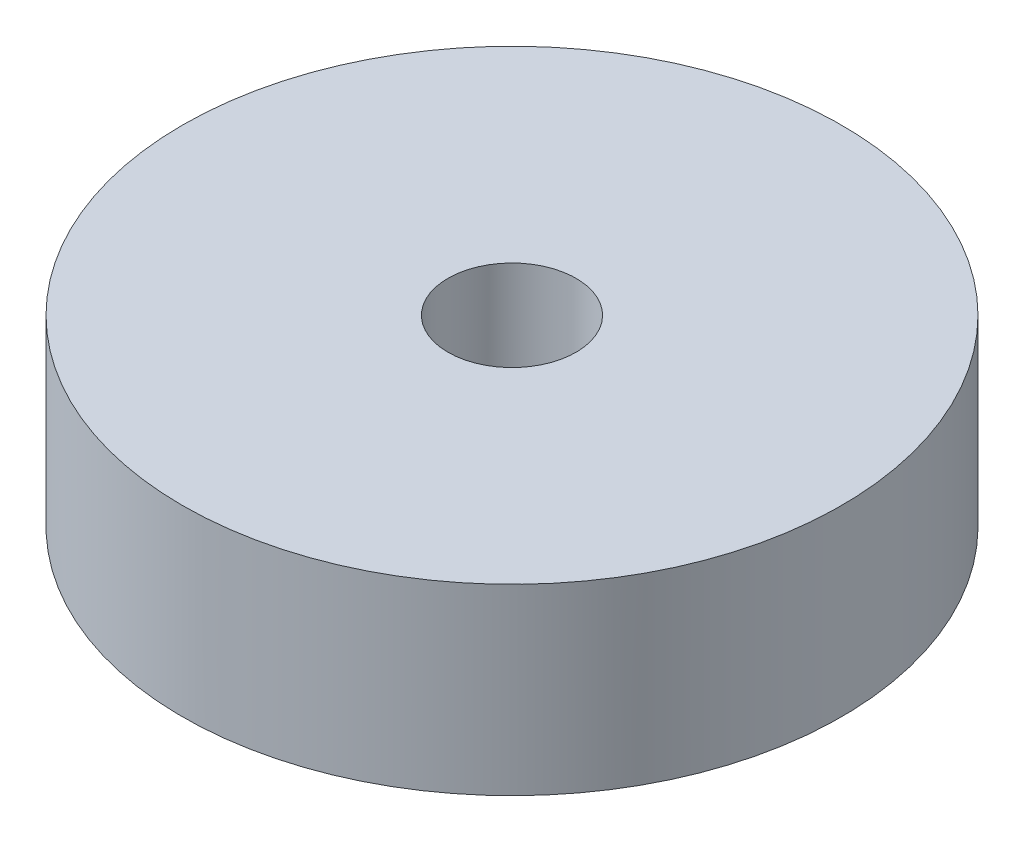
ISO-10303-21;
HEADER;
FILE_DESCRIPTION(('STEP AP214'),'2;1');
FILE_NAME('part.step','',(''),(''),'','','');
FILE_SCHEMA(('AUTOMOTIVE_DESIGN { 1 0 10303 214 1 1 1 1 }'));
ENDSEC;
DATA;
#1=APPLICATION_CONTEXT('core data for automotive mechanical design processes');
#2=APPLICATION_PROTOCOL_DEFINITION('international standard','automotive_design',2000,#1);
#3=PRODUCT_CONTEXT('',#1,'mechanical');
#4=PRODUCT('Part','Part','',(#3));
#5=PRODUCT_RELATED_PRODUCT_CATEGORY('part','',(#4));
#6=PRODUCT_DEFINITION_FORMATION('','',#4);
#7=PRODUCT_DEFINITION_CONTEXT('part definition',#1,'design');
#8=PRODUCT_DEFINITION('design','',#6,#7);
#9=PRODUCT_DEFINITION_SHAPE('','',#8);
#10=(LENGTH_UNIT() NAMED_UNIT(*) SI_UNIT(.MILLI.,.METRE.));
#11=(NAMED_UNIT(*) PLANE_ANGLE_UNIT() SI_UNIT($,.RADIAN.));
#12=(NAMED_UNIT(*) SI_UNIT($,.STERADIAN.) SOLID_ANGLE_UNIT());
#13=UNCERTAINTY_MEASURE_WITH_UNIT(LENGTH_MEASURE(1.E-05),#10,'distance_accuracy_value','');
#14=(GEOMETRIC_REPRESENTATION_CONTEXT(3) GLOBAL_UNCERTAINTY_ASSIGNED_CONTEXT((#13)) GLOBAL_UNIT_ASSIGNED_CONTEXT((#10,
#11,#12)) REPRESENTATION_CONTEXT('',''));
#15=CARTESIAN_POINT('',(0.,0.,0.));
#16=DIRECTION('',(0.,0.,1.));
#17=DIRECTION('',(1.,0.,0.));
#18=AXIS2_PLACEMENT_3D('',#15,#16,#17);
#19=CARTESIAN_POINT('',(0.,0.,0.));
#20=DIRECTION('',(0.,1.,0.));
#21=DIRECTION('',(0.,0.,1.));
#22=AXIS2_PLACEMENT_3D('',#19,#20,#21);
#23=PLANE('',#22);
#24=CARTESIAN_POINT('',(0.,0.,0.));
#25=DIRECTION('',(0.,-1.,0.));
#26=DIRECTION('',(1.,0.,0.));
#27=AXIS2_PLACEMENT_3D('',#24,#25,#26);
#28=CIRCLE('',#27,1.75);
#29=CARTESIAN_POINT('',(-1.75,0.,0.));
#30=VERTEX_POINT('',#29);
#31=EDGE_CURVE('E46',#30,#30,#28,.T.);
#32=ORIENTED_EDGE('',*,*,#31,.F.);
#33=EDGE_LOOP('',(#32));
#34=FACE_BOUND('',#33,.T.);
#35=CARTESIAN_POINT('',(0.,0.,0.));
#36=DIRECTION('',(0.,1.,0.));
#37=DIRECTION('',(-1.,0.,0.));
#38=AXIS2_PLACEMENT_3D('',#35,#36,#37);
#39=CIRCLE('',#38,9.);
#40=CARTESIAN_POINT('',(-9.,0.,0.));
#41=VERTEX_POINT('',#40);
#42=EDGE_CURVE('E11',#41,#41,#39,.T.);
#43=ORIENTED_EDGE('',*,*,#42,.F.);
#44=EDGE_LOOP('',(#43));
#45=FACE_BOUND('',#44,.T.);
#46=ADVANCED_FACE('F43',(#34,#45),#23,.F.);
#47=CARTESIAN_POINT('',(0.,0.,0.));
#48=DIRECTION('',(0.,-1.,0.));
#49=DIRECTION('',(-1.,0.,0.));
#50=AXIS2_PLACEMENT_3D('',#47,#48,#49);
#51=CYLINDRICAL_SURFACE('',#50,9.);
#52=ORIENTED_EDGE('',*,*,#42,.T.);
#53=EDGE_LOOP('',(#52));
#54=FACE_BOUND('',#53,.T.);
#55=CARTESIAN_POINT('',(0.,5.,0.));
#56=DIRECTION('',(0.,1.,0.));
#57=DIRECTION('',(0.,0.,1.));
#58=AXIS2_PLACEMENT_3D('',#55,#56,#57);
#59=CIRCLE('',#58,9.);
#60=CARTESIAN_POINT('',(0.,5.,9.));
#61=VERTEX_POINT('',#60);
#62=EDGE_CURVE('E62',#61,#61,#59,.T.);
#63=ORIENTED_EDGE('',*,*,#62,.F.);
#64=EDGE_LOOP('',(#63));
#65=FACE_BOUND('',#64,.T.);
#66=ADVANCED_FACE('F80',(#54,#65),#51,.T.);
#67=CARTESIAN_POINT('',(0.,0.,0.));
#68=DIRECTION('',(0.,-1.,0.));
#69=DIRECTION('',(1.,0.,0.));
#70=AXIS2_PLACEMENT_3D('',#67,#68,#69);
#71=CYLINDRICAL_SURFACE('',#70,1.75);
#72=ORIENTED_EDGE('',*,*,#31,.T.);
#73=EDGE_LOOP('',(#72));
#74=FACE_BOUND('',#73,.T.);
#75=CARTESIAN_POINT('',(0.,5.,0.));
#76=DIRECTION('',(0.,1.,0.));
#77=DIRECTION('',(0.,0.,1.));
#78=AXIS2_PLACEMENT_3D('',#75,#76,#77);
#79=CIRCLE('',#78,1.75);
#80=CARTESIAN_POINT('',(0.,5.,1.75));
#81=VERTEX_POINT('',#80);
#82=EDGE_CURVE('E66',#81,#81,#79,.T.);
#83=ORIENTED_EDGE('',*,*,#82,.T.);
#84=EDGE_LOOP('',(#83));
#85=FACE_BOUND('',#84,.T.);
#86=ADVANCED_FACE('F58',(#74,#85),#71,.F.);
#87=CARTESIAN_POINT('',(0.,5.,0.));
#88=DIRECTION('',(0.,1.,0.));
#89=DIRECTION('',(0.,0.,1.));
#90=AXIS2_PLACEMENT_3D('',#87,#88,#89);
#91=PLANE('',#90);
#92=ORIENTED_EDGE('',*,*,#62,.T.);
#93=EDGE_LOOP('',(#92));
#94=FACE_BOUND('',#93,.T.);
#95=ORIENTED_EDGE('',*,*,#82,.F.);
#96=EDGE_LOOP('',(#95));
#97=FACE_BOUND('',#96,.T.);
#98=ADVANCED_FACE('F74',(#94,#97),#91,.T.);
#99=CLOSED_SHELL('',(#46,#66,#86,#98));
#100=MANIFOLD_SOLID_BREP('B2',#99);
#101=ADVANCED_BREP_SHAPE_REPRESENTATION('',(#18,#100),#14);
#102=SHAPE_DEFINITION_REPRESENTATION(#9,#101);
ENDSEC;
END-ISO-10303-21;
